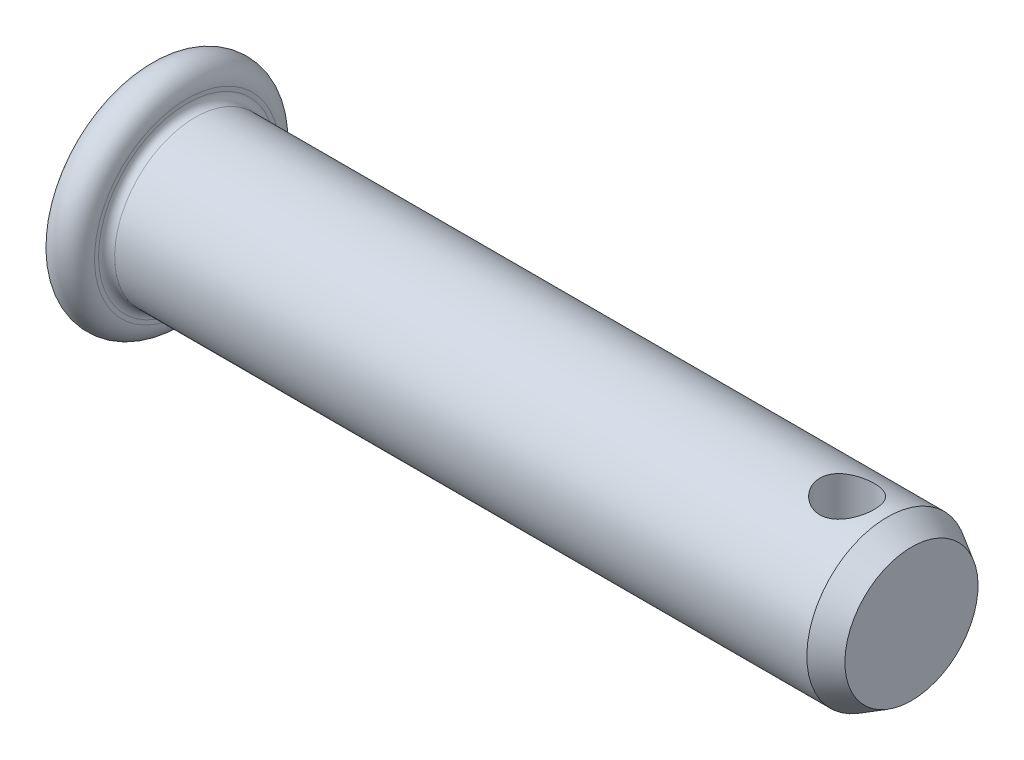
ISO-10303-21;
HEADER;
FILE_DESCRIPTION(('STEP AP214'),'2;1');
FILE_NAME('part.step','',(''),(''),'','','');
FILE_SCHEMA(('AUTOMOTIVE_DESIGN { 1 0 10303 214 1 1 1 1 }'));
ENDSEC;
DATA;
#1=APPLICATION_CONTEXT('core data for automotive mechanical design processes');
#2=APPLICATION_PROTOCOL_DEFINITION('international standard','automotive_design',2000,#1);
#3=PRODUCT_CONTEXT('',#1,'mechanical');
#4=PRODUCT('Part','Part','',(#3));
#5=PRODUCT_RELATED_PRODUCT_CATEGORY('part','',(#4));
#6=PRODUCT_DEFINITION_FORMATION('','',#4);
#7=PRODUCT_DEFINITION_CONTEXT('part definition',#1,'design');
#8=PRODUCT_DEFINITION('design','',#6,#7);
#9=PRODUCT_DEFINITION_SHAPE('','',#8);
#10=(LENGTH_UNIT() NAMED_UNIT(*) SI_UNIT(.MILLI.,.METRE.));
#11=(NAMED_UNIT(*) PLANE_ANGLE_UNIT() SI_UNIT($,.RADIAN.));
#12=(NAMED_UNIT(*) SI_UNIT($,.STERADIAN.) SOLID_ANGLE_UNIT());
#13=UNCERTAINTY_MEASURE_WITH_UNIT(LENGTH_MEASURE(1.E-05),#10,'distance_accuracy_value','');
#14=(GEOMETRIC_REPRESENTATION_CONTEXT(3) GLOBAL_UNCERTAINTY_ASSIGNED_CONTEXT((#13)) GLOBAL_UNIT_ASSIGNED_CONTEXT((#10,
#11,#12)) REPRESENTATION_CONTEXT('',''));
#15=CARTESIAN_POINT('',(0.,0.,0.));
#16=DIRECTION('',(0.,0.,1.));
#17=DIRECTION('',(1.,0.,0.));
#18=AXIS2_PLACEMENT_3D('',#15,#16,#17);
#19=CARTESIAN_POINT('',(47.5,0.,0.));
#20=DIRECTION('',(-1.,0.,0.));
#21=DIRECTION('',(0.,-1.,0.));
#22=AXIS2_PLACEMENT_3D('',#19,#20,#21);
#23=PLANE('',#22);
#24=CARTESIAN_POINT('',(47.5,0.,0.));
#25=DIRECTION('',(-1.,0.,0.));
#26=DIRECTION('',(0.,-1.,0.));
#27=AXIS2_PLACEMENT_3D('',#24,#25,#26);
#28=CIRCLE('',#27,4.13397459621556);
#29=CARTESIAN_POINT('',(47.5,-4.13397459621556,0.));
#30=VERTEX_POINT('',#29);
#31=EDGE_CURVE('E121',#30,#30,#28,.T.);
#32=ORIENTED_EDGE('',*,*,#31,.F.);
#33=EDGE_LOOP('',(#32));
#34=FACE_BOUND('',#33,.T.);
#35=ADVANCED_FACE('F41',(#34),#23,.F.);
#36=CARTESIAN_POINT('',(0.,0.,0.));
#37=DIRECTION('',(1.,0.,0.));
#38=DIRECTION('',(0.,1.,0.));
#39=AXIS2_PLACEMENT_3D('',#36,#37,#38);
#40=PLANE('',#39);
#41=CARTESIAN_POINT('',(0.,0.,0.));
#42=DIRECTION('',(-1.,0.,0.));
#43=DIRECTION('',(0.,-1.,0.));
#44=AXIS2_PLACEMENT_3D('',#41,#42,#43);
#45=CIRCLE('',#44,5.75);
#46=CARTESIAN_POINT('',(0.,-5.75,0.));
#47=VERTEX_POINT('',#46);
#48=EDGE_CURVE('E61',#47,#47,#45,.T.);
#49=ORIENTED_EDGE('',*,*,#48,.T.);
#50=EDGE_LOOP('',(#49));
#51=FACE_BOUND('',#50,.T.);
#52=ADVANCED_FACE('F92',(#51),#40,.F.);
#53=CARTESIAN_POINT('',(1.25,0.,0.));
#54=DIRECTION('',(-1.,0.,0.));
#55=DIRECTION('',(0.,-1.,0.));
#56=AXIS2_PLACEMENT_3D('',#53,#54,#55);
#57=TOROIDAL_SURFACE('',#56,5.75,1.25);
#58=ORIENTED_EDGE('',*,*,#48,.F.);
#59=EDGE_LOOP('',(#58));
#60=FACE_BOUND('',#59,.T.);
#61=CARTESIAN_POINT('',(2.5,0.,0.));
#62=DIRECTION('',(-1.,0.,0.));
#63=DIRECTION('',(0.,-1.,0.));
#64=AXIS2_PLACEMENT_3D('',#61,#62,#63);
#65=CIRCLE('',#64,5.75);
#66=CARTESIAN_POINT('',(2.5,-5.75,0.));
#67=VERTEX_POINT('',#66);
#68=EDGE_CURVE('E112',#67,#67,#65,.T.);
#69=ORIENTED_EDGE('',*,*,#68,.T.);
#70=EDGE_LOOP('',(#69));
#71=FACE_BOUND('',#70,.T.);
#72=ADVANCED_FACE('F97',(#60,#71),#57,.T.);
#73=CARTESIAN_POINT('',(2.5,5.,0.));
#74=DIRECTION('',(-1.,0.,0.));
#75=DIRECTION('',(0.,-1.,0.));
#76=AXIS2_PLACEMENT_3D('',#73,#74,#75);
#77=PLANE('',#76);
#78=CARTESIAN_POINT('',(2.5,0.,0.));
#79=DIRECTION('',(-1.,0.,0.));
#80=DIRECTION('',(0.,-1.,0.));
#81=AXIS2_PLACEMENT_3D('',#78,#79,#80);
#82=CIRCLE('',#81,5.5);
#83=CARTESIAN_POINT('',(2.5,-5.50000000000001,0.));
#84=VERTEX_POINT('',#83);
#85=EDGE_CURVE('E55',#84,#84,#82,.T.);
#86=ORIENTED_EDGE('',*,*,#85,.T.);
#87=EDGE_LOOP('',(#86));
#88=FACE_BOUND('',#87,.T.);
#89=ORIENTED_EDGE('',*,*,#68,.F.);
#90=EDGE_LOOP('',(#89));
#91=FACE_BOUND('',#90,.T.);
#92=ADVANCED_FACE('F87',(#88,#91),#77,.F.);
#93=CARTESIAN_POINT('',(-19.830028721469,0.,0.));
#94=DIRECTION('',(-1.,0.,0.));
#95=DIRECTION('',(0.,-1.,0.));
#96=AXIS2_PLACEMENT_3D('',#93,#94,#95);
#97=CYLINDRICAL_SURFACE('',#96,5.);
#98=CARTESIAN_POINT('',(45.19,-5.,0.));
#99=CARTESIAN_POINT('',(45.1900006918504,-5.00000045056717,-0.0921385131153165));
#100=CARTESIAN_POINT('',(45.1824405119812,-4.99742980033067,-0.184272351405151));
#101=CARTESIAN_POINT('',(45.152495224045,-4.98742855442286,-0.365821855868843));
#102=CARTESIAN_POINT('',(45.1301089883997,-4.97999758910651,-0.45523731475852));
#103=CARTESIAN_POINT('',(45.0713696916064,-4.96108211682783,-0.628706537182498));
#104=CARTESIAN_POINT('',(45.0350403717091,-4.94960450288728,-0.712769133037773));
#105=CARTESIAN_POINT('',(44.949554915602,-4.92376417409424,-0.873607547611708));
#106=CARTESIAN_POINT('',(44.9003961389006,-4.90940086546343,-0.950381861853268));
#107=CARTESIAN_POINT('',(44.7888159478463,-4.87872761336153,-1.09718908516297));
#108=CARTESIAN_POINT('',(44.726020551823,-4.86237009414982,-1.1669277493025));
#109=CARTESIAN_POINT('',(44.5897445946719,-4.82981068297855,-1.29511038759621));
#110=CARTESIAN_POINT('',(44.5162615975572,-4.81360882739878,-1.35355177971134));
#111=CARTESIAN_POINT('',(44.3580234426598,-4.78266857450005,-1.45918054224398));
#112=CARTESIAN_POINT('',(44.2729982244481,-4.76798796706557,-1.5059819132161));
#113=CARTESIAN_POINT('',(44.0957073752976,-4.7424775851353,-1.58449458498341));
#114=CARTESIAN_POINT('',(44.003444035897,-4.73164659783481,-1.61621063940347));
#115=CARTESIAN_POINT('',(43.8176471158009,-4.71556355120261,-1.66254228036206));
#116=CARTESIAN_POINT('',(43.7242673446411,-4.71013180305776,-1.67771041442634));
#117=CARTESIAN_POINT('',(43.5361423592289,-4.70493129849958,-1.69224311493124));
#118=CARTESIAN_POINT('',(43.4413975907791,-4.70516073326958,-1.69161272918971));
#119=CARTESIAN_POINT('',(43.257979152769,-4.71109947063846,-1.67499459106792));
#120=CARTESIAN_POINT('',(43.1692298883246,-4.71654983323877,-1.65973249174622));
#121=CARTESIAN_POINT('',(42.9956347725773,-4.73189189293263,-1.61546963423993));
#122=CARTESIAN_POINT('',(42.9107894024014,-4.74178413584829,-1.58646718760539));
#123=CARTESIAN_POINT('',(42.7457802305489,-4.76507670387297,-1.5150803423626));
#124=CARTESIAN_POINT('',(42.665716277077,-4.77853200768648,-1.47248386332134));
#125=CARTESIAN_POINT('',(42.5136452842373,-4.80741209390034,-1.37526536695573));
#126=CARTESIAN_POINT('',(42.4416406337687,-4.82283745737049,-1.32063979819046));
#127=CARTESIAN_POINT('',(42.3036607504199,-4.85493361131289,-1.19744625260549));
#128=CARTESIAN_POINT('',(42.2382180100354,-4.87162676708435,-1.12828646225945));
#129=CARTESIAN_POINT('',(42.1197183671268,-4.90365328955362,-0.979769469863469));
#130=CARTESIAN_POINT('',(42.0666627204889,-4.91898651827531,-0.900411235090659));
#131=CARTESIAN_POINT('',(41.973998382321,-4.94677682639062,-0.732596479150805));
#132=CARTESIAN_POINT('',(41.9345360277025,-4.95920217067292,-0.644053535548997));
#133=CARTESIAN_POINT('',(41.8712327603327,-4.9795458915031,-0.461064996672981));
#134=CARTESIAN_POINT('',(41.8473862613948,-4.98746587959759,-0.366621525424765));
#135=CARTESIAN_POINT('',(41.8169434906425,-4.99763779991018,-0.179017979212142));
#136=CARTESIAN_POINT('',(41.8096279601887,-5.00012589830827,-0.0859872719132733));
#137=CARTESIAN_POINT('',(41.8104010586122,-4.99986429340045,0.0999932499399037));
#138=CARTESIAN_POINT('',(41.8184870040828,-4.9971155025203,0.192943075763358));
#139=CARTESIAN_POINT('',(41.8492665278181,-4.9868449335468,0.373220245910745));
#140=CARTESIAN_POINT('',(41.8715154762021,-4.9794685322321,0.460632606881107));
#141=CARTESIAN_POINT('',(41.9294304072199,-4.96083062033554,0.630446107073969));
#142=CARTESIAN_POINT('',(41.9650981094489,-4.94956861183369,0.712846602459813));
#143=CARTESIAN_POINT('',(42.0498918993164,-4.92392538615764,0.872751427938532));
#144=CARTESIAN_POINT('',(42.09935194724,-4.9094689041066,0.950066248868442));
#145=CARTESIAN_POINT('',(42.2099358504471,-4.87907195541903,1.09553093716915));
#146=CARTESIAN_POINT('',(42.2710633560279,-4.86313102515738,1.16367792487296));
#147=CARTESIAN_POINT('',(42.4066278547169,-4.83061488465068,1.29219257149813));
#148=CARTESIAN_POINT('',(42.4815537449685,-4.81404489292989,1.3520470916564));
#149=CARTESIAN_POINT('',(42.6407395608002,-4.78290162302843,1.45840083890516));
#150=CARTESIAN_POINT('',(42.7249996274417,-4.76832837503073,1.5048998641244));
#151=CARTESIAN_POINT('',(42.9005558467309,-4.74296479117321,1.58302861289797));
#152=CARTESIAN_POINT('',(42.9918411713276,-4.73216877047788,1.6146807061863));
#153=CARTESIAN_POINT('',(43.1788975745702,-4.71575556278436,1.66201363128498));
#154=CARTESIAN_POINT('',(43.2746665345621,-4.71013595521709,1.67770192836753));
#155=CARTESIAN_POINT('',(43.4625321038996,-4.70499226252193,1.69206974596964));
#156=CARTESIAN_POINT('',(43.5545557184338,-4.70516208036229,1.69160337024957));
#157=CARTESIAN_POINT('',(43.7371397493141,-4.71081828526887,1.67578638358827));
#158=CARTESIAN_POINT('',(43.8277002571395,-4.71630433862495,1.66043670689988));
#159=CARTESIAN_POINT('',(44.0029727124063,-4.73174387519661,1.61590051246225));
#160=CARTESIAN_POINT('',(44.0877656012953,-4.74160540451004,1.58699813825242));
#161=CARTESIAN_POINT('',(44.2513623914585,-4.76464852544709,1.51640905723716));
#162=CARTESIAN_POINT('',(44.3301649351356,-4.77783086676635,1.47471946316784));
#163=CARTESIAN_POINT('',(44.4833584654807,-4.80676383911182,1.37756883958769));
#164=CARTESIAN_POINT('',(44.5573954528445,-4.8226028540317,1.32157609835243));
#165=CARTESIAN_POINT('',(44.6952981751836,-4.85470196582897,1.19829918039497));
#166=CARTESIAN_POINT('',(44.7591609864161,-4.87096218219153,1.13101176930182));
#167=CARTESIAN_POINT('',(44.8775130005392,-4.90286225421893,0.983784682070706));
#168=CARTESIAN_POINT('',(44.93151781827,-4.91845031404995,0.903442955866435));
#169=CARTESIAN_POINT('',(45.0252007714089,-4.94652737592363,0.73430402824129));
#170=CARTESIAN_POINT('',(45.0648820931723,-4.95901706702509,0.645508712937844));
#171=CARTESIAN_POINT('',(45.1274112572639,-4.97910830402289,0.465200551816097));
#172=CARTESIAN_POINT('',(45.1508050538972,-4.9868671747766,0.373895037638044));
#173=CARTESIAN_POINT('',(45.1820967790642,-4.9973120419477,0.1883908107909));
#174=CARTESIAN_POINT('',(45.1899992927232,-4.99999953938636,0.0941929625841444));
#175=CARTESIAN_POINT('',(45.19,-5.,0.));
#176=B_SPLINE_CURVE_WITH_KNOTS('',3,(#98,#99,#100,#101,#102,#103,#104,#105,#106,#107,#108,#109,
#110,#111,#112,#113,#114,#115,#116,#117,#118,#119,#120,#121,#122,#123,#124,#125,#126,#127,#128,
#129,#130,#131,#132,#133,#134,#135,#136,#137,#138,#139,#140,#141,#142,#143,#144,#145,#146,#147,
#148,#149,#150,#151,#152,#153,#154,#155,#156,#157,#158,#159,#160,#161,#162,#163,#164,#165,#166,
#167,#168,#169,#170,#171,#172,#173,#174,#175),.UNSPECIFIED.,.T.,.F.,(4,2,2,2,2,2,2,2,2,2,2,2,2,
2,2,2,2,2,2,2,2,2,2,2,2,2,2,2,2,2,2,2,2,2,2,2,2,2,4),(0.,0.276068824773615,0.552158648049827,
0.827780436845117,1.10345899746949,1.38795697907979,1.67251990722092,1.9655383046997,
2.25846430611442,2.54127784994967,2.82400103259504,3.09339103343422,3.36281414621342,
3.63666483506979,3.91059648363436,4.19925962343989,4.48795201714564,4.77966169105387,
5.07126695594425,5.34991803682658,5.62852057263641,5.89878121161703,6.16907649593832,
6.44658980000859,6.72419007002307,7.01477826618175,7.30537085441403,7.59552419187037,
7.8855417802571,8.16025065602601,8.43494228891763,8.70411601025339,8.97335055391008,
9.25460455637487,9.53593923729814,9.82866803170858,10.121331666494,10.4036396792684,
10.6858641216143),.UNSPECIFIED.);
#177=CARTESIAN_POINT('',(45.19,-5.,0.));
#178=VERTEX_POINT('',#177);
#179=EDGE_CURVE('E45',#178,#178,#176,.T.);
#180=ORIENTED_EDGE('',*,*,#179,.T.);
#181=EDGE_LOOP('',(#180));
#182=FACE_BOUND('',#181,.T.);
#183=CARTESIAN_POINT('',(43.5,4.70573054902212,1.69));
#184=CARTESIAN_POINT('',(43.408031457333,4.70573000528724,1.69000070852625));
#185=CARTESIAN_POINT('',(43.3160676352778,4.70845614295335,1.68246736586167));
#186=CARTESIAN_POINT('',(43.134869748614,4.71900744775723,1.65263836623879));
#187=CARTESIAN_POINT('',(43.0456360721963,4.72683333651731,1.63034062008839));
#188=CARTESIAN_POINT('',(42.8725537881386,4.74659862882115,1.57185969208585));
#189=CARTESIAN_POINT('',(42.7886947752268,4.75852978056926,1.53570434825442));
#190=CARTESIAN_POINT('',(42.628204796293,4.78514912030707,1.45063003281526));
#191=CARTESIAN_POINT('',(42.5515754998777,4.79983794281378,1.40170812271493));
#192=CARTESIAN_POINT('',(42.4046364158929,4.83098043192526,1.29038050191949));
#193=CARTESIAN_POINT('',(42.3346598616982,4.84747897413991,1.22754740792189));
#194=CARTESIAN_POINT('',(42.2060091852618,4.88000316329026,1.09109255205413));
#195=CARTESIAN_POINT('',(42.1473369362658,4.8960287314771,1.01746900564205));
#196=CARTESIAN_POINT('',(42.0414385412422,4.9263223701437,0.859076451772158));
#197=CARTESIAN_POINT('',(41.9945629404002,4.9405315337328,0.774060813082529));
#198=CARTESIAN_POINT('',(41.9159106702385,4.96506149834048,0.596788082066133));
#199=CARTESIAN_POINT('',(41.8841298094177,4.97538337861325,0.504533008283433));
#200=CARTESIAN_POINT('',(41.8377032882565,4.99065784685647,0.318895105621444));
#201=CARTESIAN_POINT('',(41.8224864718865,4.99578894278889,0.225670081395814));
#202=CARTESIAN_POINT('',(41.8078024286421,5.00073809893505,0.0378581123198387));
#203=CARTESIAN_POINT('',(41.8083310304546,5.00055756631804,-0.0567284651877348));
#204=CARTESIAN_POINT('',(41.8247636935164,4.99502398684516,-0.240530442796586));
#205=CARTESIAN_POINT('',(41.8400470762719,4.98987974909304,-0.329808656609212));
#206=CARTESIAN_POINT('',(41.8845271718276,4.97526018255719,-0.504449183690133));
#207=CARTESIAN_POINT('',(41.9137248341748,4.9657845581901,-0.58981122927295));
#208=CARTESIAN_POINT('',(41.9855588574035,4.94330427659483,-0.755536260667334));
#209=CARTESIAN_POINT('',(42.0283691724393,4.93025425993232,-0.83581743859392));
#210=CARTESIAN_POINT('',(42.1260688967338,4.90197960145489,-0.988237741697661));
#211=CARTESIAN_POINT('',(42.180961730445,4.88675434355877,-1.0603745497937));
#212=CARTESIAN_POINT('',(42.3043817854772,4.85486204601166,-1.19814745922028));
#213=CARTESIAN_POINT('',(42.3734396876571,4.8381608878543,-1.26330096757399));
#214=CARTESIAN_POINT('',(42.5216397307293,4.80581602303003,-1.3812612543304));
#215=CARTESIAN_POINT('',(42.6007835150626,4.79017248933464,-1.43406601658603));
#216=CARTESIAN_POINT('',(42.7684772701205,4.76152418153718,-1.52652370830052));
#217=CARTESIAN_POINT('',(42.85715068464,4.74856257864028,-1.56596714724568));
#218=CARTESIAN_POINT('',(43.0404298010655,4.72724497541913,-1.6291965766666));
#219=CARTESIAN_POINT('',(43.1350329129242,4.7188869796739,-1.65298935175003));
#220=CARTESIAN_POINT('',(43.3228003247017,4.70817645900976,-1.68324735084614));
#221=CARTESIAN_POINT('',(43.4158289024272,4.70556412713612,-1.6904628838659));
#222=CARTESIAN_POINT('',(43.601784692007,4.70591345274982,-1.68949122272273));
#223=CARTESIAN_POINT('',(43.6947119196484,4.70887406087362,-1.68130692828925));
#224=CARTESIAN_POINT('',(43.8743696322845,4.71977612743211,-1.65044286868273));
#225=CARTESIAN_POINT('',(43.9612029211109,4.72753617455771,-1.62829050474266));
#226=CARTESIAN_POINT('',(44.1299003739918,4.74696151170112,-1.57075522808945));
#227=CARTESIAN_POINT('',(44.2117636384884,4.75862750620783,-1.53536992850785));
#228=CARTESIAN_POINT('',(44.3711367765386,4.78501786010993,-1.45107186939904));
#229=CARTESIAN_POINT('',(44.4484197645754,4.79982903992136,-1.40175808389253));
#230=CARTESIAN_POINT('',(44.5938846017369,4.83067495097899,-1.29145428764301));
#231=CARTESIAN_POINT('',(44.6620636849067,4.84671005176271,-1.23046074198518));
#232=CARTESIAN_POINT('',(44.7908884342199,4.87916082844229,-1.09493086460888));
#233=CARTESIAN_POINT('',(44.8509913950697,4.89555582044436,-1.01987217556628));
#234=CARTESIAN_POINT('',(44.957787176883,4.92609562252592,-0.860330721449049));
#235=CARTESIAN_POINT('',(45.0044804332735,4.94024050566211,-0.77584826249765));
#236=CARTESIAN_POINT('',(45.0827123723036,4.96462493653938,-0.600248030552289));
#237=CARTESIAN_POINT('',(45.1143462045983,4.97488891771341,-0.509176222637723));
#238=CARTESIAN_POINT('',(45.1617134829704,4.99045939950963,-0.322588725796816));
#239=CARTESIAN_POINT('',(45.1774528488992,4.99576774578906,-0.227074705235695));
#240=CARTESIAN_POINT('',(45.1920398648111,5.00068566157364,-0.0392712628295704));
#241=CARTESIAN_POINT('',(45.1916656206947,5.00055774538541,0.0529514913033042));
#242=CARTESIAN_POINT('',(45.1759642211632,4.995267920959,0.235958959364556));
#243=CARTESIAN_POINT('',(45.1606383369512,4.99010644067937,0.326743794879338));
#244=CARTESIAN_POINT('',(45.1159889659031,4.97542847606851,0.50278361149543));
#245=CARTESIAN_POINT('',(45.0869037664643,4.96598623879562,0.58810566573928));
#246=CARTESIAN_POINT('',(45.0157835477129,4.94371953745451,0.752689408815465));
#247=CARTESIAN_POINT('',(44.9737461647608,4.93089445611382,0.831949988193378));
#248=CARTESIAN_POINT('',(44.8760978355214,4.90257940411559,0.985410864263535));
#249=CARTESIAN_POINT('',(44.8200360444139,4.88700737996888,1.05930893455233));
#250=CARTESIAN_POINT('',(44.6966909016656,4.85514405204458,1.19690149043362));
#251=CARTESIAN_POINT('',(44.6294039189462,4.83885251678038,1.26059266122734));
#252=CARTESIAN_POINT('',(44.4822562117124,4.80659724574638,1.37859382499613));
#253=CARTESIAN_POINT('',(44.4019961189298,4.7906736236506,1.43241839089534));
#254=CARTESIAN_POINT('',(44.233071520515,4.76176303840918,1.52578272074006));
#255=CARTESIAN_POINT('',(44.1444089204398,4.74877541167691,1.56532571378233));
#256=CARTESIAN_POINT('',(43.9643991527001,4.72777691403826,1.62762854332163));
#257=CARTESIAN_POINT('',(43.8732621061069,4.71960435057484,1.65093912359502));
#258=CARTESIAN_POINT('',(43.68808099871,4.70858243533796,1.6821216204916));
#259=CARTESIAN_POINT('',(43.5940380316302,4.7057311049922,1.68999927553039));
#260=CARTESIAN_POINT('',(43.5,4.70573054902212,1.69));
#261=B_SPLINE_CURVE_WITH_KNOTS('',3,(#183,#184,#185,#186,#187,#188,#189,#190,#191,#192,#193,
#194,#195,#196,#197,#198,#199,#200,#201,#202,#203,#204,#205,#206,#207,#208,#209,#210,#211,#212,
#213,#214,#215,#216,#217,#218,#219,#220,#221,#222,#223,#224,#225,#226,#227,#228,#229,#230,#231,
#232,#233,#234,#235,#236,#237,#238,#239,#240,#241,#242,#243,#244,#245,#246,#247,#248,#249,#250,
#251,#252,#253,#254,#255,#256,#257,#258,#259,#260),.UNSPECIFIED.,.T.,.F.,(4,2,2,2,2,2,2,2,2,2,2,
2,2,2,2,2,2,2,2,2,2,2,2,2,2,2,2,2,2,2,2,2,2,2,2,2,2,2,4),(0.,0.275557180238399,
0.551153360694022,0.826198783477875,1.1013075696506,1.38646895230613,1.67167754872578,
1.96456195130985,2.25736497825656,2.53971624176164,2.82199270477312,3.09288996641885,
3.36380571745117,3.63833286967149,3.91293792936166,4.2008129693333,4.48873497713801,
4.78098230041688,5.07310285000389,5.35171660910322,5.63027791153222,5.89890414203833,
6.1675788489363,6.44495580279192,6.72241683868573,7.01366547758173,7.30490465826474,
7.59427844888416,7.88354442321696,8.15885852953677,8.43414923042232,8.70483777273374,
8.97557574218757,9.25649110907305,9.53749752212659,9.82990440027489,10.1222451230987,
10.4041077541312,10.6858655604392),.UNSPECIFIED.);
#262=CARTESIAN_POINT('',(43.5,4.70573054902212,1.69));
#263=VERTEX_POINT('',#262);
#264=EDGE_CURVE('E64',#263,#263,#261,.T.);
#265=ORIENTED_EDGE('',*,*,#264,.T.);
#266=EDGE_LOOP('',(#265));
#267=FACE_BOUND('',#266,.T.);
#268=CARTESIAN_POINT('',(3.,0.,0.));
#269=DIRECTION('',(-1.,0.,0.));
#270=DIRECTION('',(0.,-1.,0.));
#271=AXIS2_PLACEMENT_3D('',#268,#269,#270);
#272=CIRCLE('',#271,5.);
#273=CARTESIAN_POINT('',(3.,-5.,0.));
#274=VERTEX_POINT('',#273);
#275=EDGE_CURVE('E10',#274,#274,#272,.F.);
#276=ORIENTED_EDGE('',*,*,#275,.T.);
#277=EDGE_LOOP('',(#276));
#278=FACE_BOUND('',#277,.T.);
#279=CARTESIAN_POINT('',(46.,0.,0.));
#280=DIRECTION('',(-1.,0.,0.));
#281=DIRECTION('',(0.,-1.,0.));
#282=AXIS2_PLACEMENT_3D('',#279,#280,#281);
#283=CIRCLE('',#282,5.);
#284=CARTESIAN_POINT('',(46.,-5.00000000000001,0.));
#285=VERTEX_POINT('',#284);
#286=EDGE_CURVE('E115',#285,#285,#283,.T.);
#287=ORIENTED_EDGE('',*,*,#286,.T.);
#288=EDGE_LOOP('',(#287));
#289=FACE_BOUND('',#288,.T.);
#290=ADVANCED_FACE('F70',(#182,#267,#278,#289),#97,.T.);
#291=CARTESIAN_POINT('',(47.5,0.,0.));
#292=DIRECTION('',(-1.,0.,0.));
#293=DIRECTION('',(0.,-1.,0.));
#294=AXIS2_PLACEMENT_3D('',#291,#292,#293);
#295=CONICAL_SURFACE('',#294,4.13397459621556,0.5235987755983);
#296=ORIENTED_EDGE('',*,*,#286,.F.);
#297=EDGE_LOOP('',(#296));
#298=FACE_BOUND('',#297,.T.);
#299=ORIENTED_EDGE('',*,*,#31,.T.);
#300=EDGE_LOOP('',(#299));
#301=FACE_BOUND('',#300,.T.);
#302=ADVANCED_FACE('F78',(#298,#301),#295,.T.);
#303=CARTESIAN_POINT('',(3.,0.,0.));
#304=DIRECTION('',(-1.,0.,0.));
#305=DIRECTION('',(0.,-1.,0.));
#306=AXIS2_PLACEMENT_3D('',#303,#304,#305);
#307=TOROIDAL_SURFACE('',#306,5.5,0.5);
#308=ORIENTED_EDGE('',*,*,#275,.F.);
#309=EDGE_LOOP('',(#308));
#310=FACE_BOUND('',#309,.T.);
#311=ORIENTED_EDGE('',*,*,#85,.F.);
#312=EDGE_LOOP('',(#311));
#313=FACE_BOUND('',#312,.T.);
#314=ADVANCED_FACE('F43',(#310,#313),#307,.F.);
#315=CARTESIAN_POINT('',(43.5,-7.,0.));
#316=DIRECTION('',(0.,1.,0.));
#317=DIRECTION('',(0.,0.,1.));
#318=AXIS2_PLACEMENT_3D('',#315,#316,#317);
#319=CYLINDRICAL_SURFACE('',#318,1.69);
#320=ORIENTED_EDGE('',*,*,#264,.F.);
#321=EDGE_LOOP('',(#320));
#322=FACE_BOUND('',#321,.T.);
#323=ORIENTED_EDGE('',*,*,#179,.F.);
#324=EDGE_LOOP('',(#323));
#325=FACE_BOUND('',#324,.T.);
#326=ADVANCED_FACE('F74',(#322,#325),#319,.F.);
#327=CLOSED_SHELL('',(#35,#52,#72,#92,#290,#302,#314,#326));
#328=MANIFOLD_SOLID_BREP('B2',#327);
#329=ADVANCED_BREP_SHAPE_REPRESENTATION('',(#18,#328),#14);
#330=SHAPE_DEFINITION_REPRESENTATION(#9,#329);
ENDSEC;
END-ISO-10303-21;
